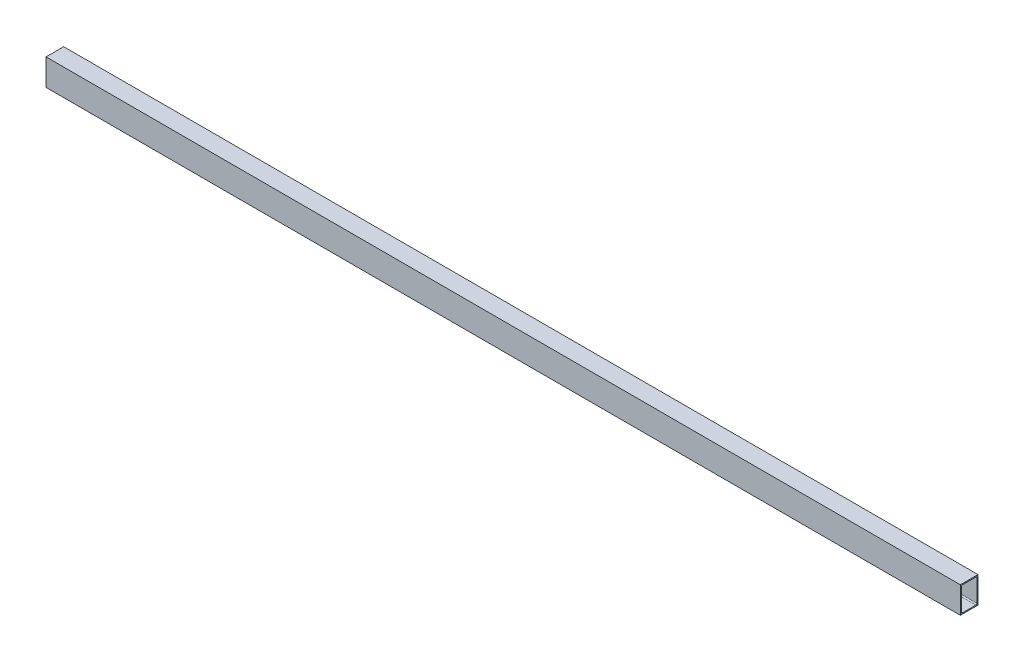
ISO-10303-21;
HEADER;
FILE_DESCRIPTION(('STEP AP214'),'2;1');
FILE_NAME('part.step','',(''),(''),'','','');
FILE_SCHEMA(('AUTOMOTIVE_DESIGN { 1 0 10303 214 1 1 1 1 }'));
ENDSEC;
DATA;
#1=APPLICATION_CONTEXT('core data for automotive mechanical design processes');
#2=APPLICATION_PROTOCOL_DEFINITION('international standard','automotive_design',2000,#1);
#3=PRODUCT_CONTEXT('',#1,'mechanical');
#4=PRODUCT('Part','Part','',(#3));
#5=PRODUCT_RELATED_PRODUCT_CATEGORY('part','',(#4));
#6=PRODUCT_DEFINITION_FORMATION('','',#4);
#7=PRODUCT_DEFINITION_CONTEXT('part definition',#1,'design');
#8=PRODUCT_DEFINITION('design','',#6,#7);
#9=PRODUCT_DEFINITION_SHAPE('','',#8);
#10=(LENGTH_UNIT() NAMED_UNIT(*) SI_UNIT(.MILLI.,.METRE.));
#11=(NAMED_UNIT(*) PLANE_ANGLE_UNIT() SI_UNIT($,.RADIAN.));
#12=(NAMED_UNIT(*) SI_UNIT($,.STERADIAN.) SOLID_ANGLE_UNIT());
#13=UNCERTAINTY_MEASURE_WITH_UNIT(LENGTH_MEASURE(1.E-05),#10,'distance_accuracy_value','');
#14=(GEOMETRIC_REPRESENTATION_CONTEXT(3) GLOBAL_UNCERTAINTY_ASSIGNED_CONTEXT((#13)) GLOBAL_UNIT_ASSIGNED_CONTEXT((#10,
#11,#12)) REPRESENTATION_CONTEXT('',''));
#15=CARTESIAN_POINT('',(0.,0.,0.));
#16=DIRECTION('',(0.,0.,1.));
#17=DIRECTION('',(1.,0.,0.));
#18=AXIS2_PLACEMENT_3D('',#15,#16,#17);
#19=CARTESIAN_POINT('',(5265.200001456,0.,0.));
#20=DIRECTION('',(1.,0.,0.));
#21=DIRECTION('',(0.,0.,-1.));
#22=AXIS2_PLACEMENT_3D('',#19,#20,#21);
#23=PLANE('',#22);
#24=DIRECTION('',(0.,1.,0.));
#25=VECTOR('',#24,1.);
#26=CARTESIAN_POINT('',(5265.200001456,0.,0.));
#27=LINE('',#26,#25);
#28=CARTESIAN_POINT('',(5265.200001456,0.,0.));
#29=VERTEX_POINT('',#28);
#30=CARTESIAN_POINT('',(5265.200001456,152.4,0.));
#31=VERTEX_POINT('',#30);
#32=EDGE_CURVE('E187',#29,#31,#27,.T.);
#33=ORIENTED_EDGE('',*,*,#32,.T.);
#34=DIRECTION('',(0.,0.,1.));
#35=VECTOR('',#34,1.);
#36=CARTESIAN_POINT('',(5265.200001456,152.4,0.));
#37=LINE('',#36,#35);
#38=CARTESIAN_POINT('',(5265.200001456,152.4,101.6));
#39=VERTEX_POINT('',#38);
#40=EDGE_CURVE('E190',#31,#39,#37,.T.);
#41=ORIENTED_EDGE('',*,*,#40,.T.);
#42=DIRECTION('',(0.,-1.,0.));
#43=VECTOR('',#42,1.);
#44=CARTESIAN_POINT('',(5265.200001456,0.,101.6));
#45=LINE('',#44,#43);
#46=CARTESIAN_POINT('',(5265.200001456,0.,101.6));
#47=VERTEX_POINT('',#46);
#48=EDGE_CURVE('E193',#39,#47,#45,.T.);
#49=ORIENTED_EDGE('',*,*,#48,.T.);
#50=DIRECTION('',(0.,0.,-1.));
#51=VECTOR('',#50,1.);
#52=CARTESIAN_POINT('',(5265.200001456,0.,0.));
#53=LINE('',#52,#51);
#54=EDGE_CURVE('E195',#47,#29,#53,.T.);
#55=ORIENTED_EDGE('',*,*,#54,.T.);
#56=EDGE_LOOP('',(#33,#41,#49,#55));
#57=FACE_BOUND('',#56,.T.);
#58=DIRECTION('',(0.,0.,-1.));
#59=VECTOR('',#58,1.);
#60=CARTESIAN_POINT('',(5265.200001456,6.35,12.7));
#61=LINE('',#60,#59);
#62=CARTESIAN_POINT('',(5265.200001456,6.35,88.8999999999999));
#63=VERTEX_POINT('',#62);
#64=CARTESIAN_POINT('',(5265.200001456,6.35,12.7));
#65=VERTEX_POINT('',#64);
#66=EDGE_CURVE('E130',#63,#65,#61,.T.);
#67=ORIENTED_EDGE('',*,*,#66,.F.);
#68=CARTESIAN_POINT('',(5265.200001456,12.7,88.9));
#69=DIRECTION('',(1.,0.,0.));
#70=DIRECTION('',(0.,0.,-1.));
#71=AXIS2_PLACEMENT_3D('',#68,#69,#70);
#72=CIRCLE('',#71,6.35);
#73=CARTESIAN_POINT('',(5265.200001456,12.7,95.25));
#74=VERTEX_POINT('',#73);
#75=EDGE_CURVE('E122',#74,#63,#72,.T.);
#76=ORIENTED_EDGE('',*,*,#75,.F.);
#77=DIRECTION('',(0.,-1.,0.));
#78=VECTOR('',#77,1.);
#79=CARTESIAN_POINT('',(5265.200001456,12.7,95.25));
#80=LINE('',#79,#78);
#81=CARTESIAN_POINT('',(5265.200001456,139.7,95.25));
#82=VERTEX_POINT('',#81);
#83=EDGE_CURVE('E155',#82,#74,#80,.T.);
#84=ORIENTED_EDGE('',*,*,#83,.F.);
#85=CARTESIAN_POINT('',(5265.200001456,139.7,88.9));
#86=DIRECTION('',(1.,0.,0.));
#87=DIRECTION('',(0.,0.,1.));
#88=AXIS2_PLACEMENT_3D('',#85,#86,#87);
#89=CIRCLE('',#88,6.34999999999999);
#90=CARTESIAN_POINT('',(5265.200001456,146.05,88.8999999999999));
#91=VERTEX_POINT('',#90);
#92=EDGE_CURVE('E153',#91,#82,#89,.T.);
#93=ORIENTED_EDGE('',*,*,#92,.F.);
#94=DIRECTION('',(0.,0.,1.));
#95=VECTOR('',#94,1.);
#96=CARTESIAN_POINT('',(5265.200001456,146.05,12.7));
#97=LINE('',#96,#95);
#98=CARTESIAN_POINT('',(5265.200001456,146.05,12.7));
#99=VERTEX_POINT('',#98);
#100=EDGE_CURVE('E151',#99,#91,#97,.T.);
#101=ORIENTED_EDGE('',*,*,#100,.F.);
#102=CARTESIAN_POINT('',(5265.200001456,139.7,12.7));
#103=DIRECTION('',(1.,0.,0.));
#104=DIRECTION('',(0.,0.,1.));
#105=AXIS2_PLACEMENT_3D('',#102,#103,#104);
#106=CIRCLE('',#105,6.35);
#107=CARTESIAN_POINT('',(5265.200001456,139.7,6.35));
#108=VERTEX_POINT('',#107);
#109=EDGE_CURVE('E149',#108,#99,#106,.T.);
#110=ORIENTED_EDGE('',*,*,#109,.F.);
#111=DIRECTION('',(0.,1.,0.));
#112=VECTOR('',#111,1.);
#113=CARTESIAN_POINT('',(5265.200001456,12.7,6.35));
#114=LINE('',#113,#112);
#115=CARTESIAN_POINT('',(5265.200001456,12.7,6.35));
#116=VERTEX_POINT('',#115);
#117=EDGE_CURVE('E145',#116,#108,#114,.T.);
#118=ORIENTED_EDGE('',*,*,#117,.F.);
#119=CARTESIAN_POINT('',(5265.200001456,12.7,12.7));
#120=DIRECTION('',(1.,0.,0.));
#121=DIRECTION('',(0.,0.,1.));
#122=AXIS2_PLACEMENT_3D('',#119,#120,#121);
#123=CIRCLE('',#122,6.35);
#124=EDGE_CURVE('E143',#65,#116,#123,.T.);
#125=ORIENTED_EDGE('',*,*,#124,.F.);
#126=EDGE_LOOP('',(#67,#76,#84,#93,#101,#110,#118,#125));
#127=FACE_BOUND('',#126,.T.);
#128=ADVANCED_FACE('F33',(#57,#127),#23,.T.);
#129=CARTESIAN_POINT('',(0.,0.,0.));
#130=DIRECTION('',(1.,0.,0.));
#131=DIRECTION('',(0.,0.,-1.));
#132=AXIS2_PLACEMENT_3D('',#129,#130,#131);
#133=PLANE('',#132);
#134=DIRECTION('',(0.,1.,0.));
#135=VECTOR('',#134,1.);
#136=CARTESIAN_POINT('',(0.,0.,0.));
#137=LINE('',#136,#135);
#138=CARTESIAN_POINT('',(0.,0.,0.));
#139=VERTEX_POINT('',#138);
#140=CARTESIAN_POINT('',(0.,152.4,0.));
#141=VERTEX_POINT('',#140);
#142=EDGE_CURVE('E138',#139,#141,#137,.T.);
#143=ORIENTED_EDGE('',*,*,#142,.F.);
#144=DIRECTION('',(0.,0.,-1.));
#145=VECTOR('',#144,1.);
#146=CARTESIAN_POINT('',(0.,0.,0.));
#147=LINE('',#146,#145);
#148=CARTESIAN_POINT('',(0.,0.,101.6));
#149=VERTEX_POINT('',#148);
#150=EDGE_CURVE('E191',#149,#139,#147,.T.);
#151=ORIENTED_EDGE('',*,*,#150,.F.);
#152=DIRECTION('',(0.,-1.,0.));
#153=VECTOR('',#152,1.);
#154=CARTESIAN_POINT('',(0.,0.,101.6));
#155=LINE('',#154,#153);
#156=CARTESIAN_POINT('',(0.,152.4,101.6));
#157=VERTEX_POINT('',#156);
#158=EDGE_CURVE('E202',#157,#149,#155,.T.);
#159=ORIENTED_EDGE('',*,*,#158,.F.);
#160=DIRECTION('',(0.,0.,1.));
#161=VECTOR('',#160,1.);
#162=CARTESIAN_POINT('',(0.,152.4,0.));
#163=LINE('',#162,#161);
#164=EDGE_CURVE('E200',#141,#157,#163,.T.);
#165=ORIENTED_EDGE('',*,*,#164,.F.);
#166=EDGE_LOOP('',(#143,#151,#159,#165));
#167=FACE_BOUND('',#166,.T.);
#168=CARTESIAN_POINT('',(0.,12.7,88.9));
#169=DIRECTION('',(1.,0.,0.));
#170=DIRECTION('',(0.,0.,-1.));
#171=AXIS2_PLACEMENT_3D('',#168,#169,#170);
#172=CIRCLE('',#171,6.35);
#173=CARTESIAN_POINT('',(0.,12.7,95.25));
#174=VERTEX_POINT('',#173);
#175=CARTESIAN_POINT('',(0.,6.35,88.8999999999999));
#176=VERTEX_POINT('',#175);
#177=EDGE_CURVE('E56',#174,#176,#172,.T.);
#178=ORIENTED_EDGE('',*,*,#177,.T.);
#179=DIRECTION('',(0.,0.,-1.));
#180=VECTOR('',#179,1.);
#181=CARTESIAN_POINT('',(0.,6.35,12.7));
#182=LINE('',#181,#180);
#183=CARTESIAN_POINT('',(0.,6.35,12.7));
#184=VERTEX_POINT('',#183);
#185=EDGE_CURVE('E137',#176,#184,#182,.T.);
#186=ORIENTED_EDGE('',*,*,#185,.T.);
#187=CARTESIAN_POINT('',(0.,12.7,12.7));
#188=DIRECTION('',(1.,0.,0.));
#189=DIRECTION('',(0.,0.,1.));
#190=AXIS2_PLACEMENT_3D('',#187,#188,#189);
#191=CIRCLE('',#190,6.35);
#192=CARTESIAN_POINT('',(0.,12.7,6.35));
#193=VERTEX_POINT('',#192);
#194=EDGE_CURVE('E159',#184,#193,#191,.T.);
#195=ORIENTED_EDGE('',*,*,#194,.T.);
#196=DIRECTION('',(0.,1.,0.));
#197=VECTOR('',#196,1.);
#198=CARTESIAN_POINT('',(0.,12.7,6.35));
#199=LINE('',#198,#197);
#200=CARTESIAN_POINT('',(0.,139.7,6.35));
#201=VERTEX_POINT('',#200);
#202=EDGE_CURVE('E162',#193,#201,#199,.T.);
#203=ORIENTED_EDGE('',*,*,#202,.T.);
#204=CARTESIAN_POINT('',(0.,139.7,12.7));
#205=DIRECTION('',(1.,0.,0.));
#206=DIRECTION('',(0.,0.,1.));
#207=AXIS2_PLACEMENT_3D('',#204,#205,#206);
#208=CIRCLE('',#207,6.35);
#209=CARTESIAN_POINT('',(0.,146.05,12.7));
#210=VERTEX_POINT('',#209);
#211=EDGE_CURVE('E165',#201,#210,#208,.T.);
#212=ORIENTED_EDGE('',*,*,#211,.T.);
#213=DIRECTION('',(0.,0.,1.));
#214=VECTOR('',#213,1.);
#215=CARTESIAN_POINT('',(0.,146.05,12.7));
#216=LINE('',#215,#214);
#217=CARTESIAN_POINT('',(0.,146.05,88.8999999999999));
#218=VERTEX_POINT('',#217);
#219=EDGE_CURVE('E168',#210,#218,#216,.T.);
#220=ORIENTED_EDGE('',*,*,#219,.T.);
#221=CARTESIAN_POINT('',(0.,139.7,88.9));
#222=DIRECTION('',(1.,0.,0.));
#223=DIRECTION('',(0.,0.,1.));
#224=AXIS2_PLACEMENT_3D('',#221,#222,#223);
#225=CIRCLE('',#224,6.34999999999999);
#226=CARTESIAN_POINT('',(0.,139.7,95.25));
#227=VERTEX_POINT('',#226);
#228=EDGE_CURVE('E171',#218,#227,#225,.T.);
#229=ORIENTED_EDGE('',*,*,#228,.T.);
#230=DIRECTION('',(0.,-1.,0.));
#231=VECTOR('',#230,1.);
#232=CARTESIAN_POINT('',(0.,12.7,95.25));
#233=LINE('',#232,#231);
#234=EDGE_CURVE('E131',#227,#174,#233,.T.);
#235=ORIENTED_EDGE('',*,*,#234,.T.);
#236=EDGE_LOOP('',(#178,#186,#195,#203,#212,#220,#229,#235));
#237=FACE_BOUND('',#236,.T.);
#238=ADVANCED_FACE('F220',(#167,#237),#133,.F.);
#239=CARTESIAN_POINT('',(5265.200001456,0.,0.));
#240=DIRECTION('',(0.,0.,1.));
#241=DIRECTION('',(1.,0.,0.));
#242=AXIS2_PLACEMENT_3D('',#239,#240,#241);
#243=PLANE('',#242);
#244=ORIENTED_EDGE('',*,*,#142,.T.);
#245=DIRECTION('',(-1.,0.,0.));
#246=VECTOR('',#245,1.);
#247=CARTESIAN_POINT('',(5265.200001456,152.4,0.));
#248=LINE('',#247,#246);
#249=EDGE_CURVE('E11',#31,#141,#248,.T.);
#250=ORIENTED_EDGE('',*,*,#249,.F.);
#251=ORIENTED_EDGE('',*,*,#32,.F.);
#252=DIRECTION('',(-1.,0.,0.));
#253=VECTOR('',#252,1.);
#254=CARTESIAN_POINT('',(5265.200001456,0.,0.));
#255=LINE('',#254,#253);
#256=EDGE_CURVE('E197',#29,#139,#255,.T.);
#257=ORIENTED_EDGE('',*,*,#256,.T.);
#258=EDGE_LOOP('',(#244,#250,#251,#257));
#259=FACE_BOUND('',#258,.T.);
#260=ADVANCED_FACE('F35',(#259),#243,.F.);
#261=CARTESIAN_POINT('',(5265.200001456,152.4,0.));
#262=DIRECTION('',(0.,-1.,0.));
#263=DIRECTION('',(0.,0.,-1.));
#264=AXIS2_PLACEMENT_3D('',#261,#262,#263);
#265=PLANE('',#264);
#266=ORIENTED_EDGE('',*,*,#164,.T.);
#267=DIRECTION('',(-1.,0.,0.));
#268=VECTOR('',#267,1.);
#269=CARTESIAN_POINT('',(5265.200001456,152.4,101.6));
#270=LINE('',#269,#268);
#271=EDGE_CURVE('E41',#39,#157,#270,.T.);
#272=ORIENTED_EDGE('',*,*,#271,.F.);
#273=ORIENTED_EDGE('',*,*,#40,.F.);
#274=ORIENTED_EDGE('',*,*,#249,.T.);
#275=EDGE_LOOP('',(#266,#272,#273,#274));
#276=FACE_BOUND('',#275,.T.);
#277=ADVANCED_FACE('F230',(#276),#265,.F.);
#278=CARTESIAN_POINT('',(5265.200001456,0.,101.6));
#279=DIRECTION('',(0.,0.,-1.));
#280=DIRECTION('',(-1.,0.,0.));
#281=AXIS2_PLACEMENT_3D('',#278,#279,#280);
#282=PLANE('',#281);
#283=ORIENTED_EDGE('',*,*,#158,.T.);
#284=DIRECTION('',(-1.,0.,0.));
#285=VECTOR('',#284,1.);
#286=CARTESIAN_POINT('',(5265.200001456,0.,101.6));
#287=LINE('',#286,#285);
#288=EDGE_CURVE('E207',#47,#149,#287,.T.);
#289=ORIENTED_EDGE('',*,*,#288,.F.);
#290=ORIENTED_EDGE('',*,*,#48,.F.);
#291=ORIENTED_EDGE('',*,*,#271,.T.);
#292=EDGE_LOOP('',(#283,#289,#290,#291));
#293=FACE_BOUND('',#292,.T.);
#294=ADVANCED_FACE('F214',(#293),#282,.F.);
#295=CARTESIAN_POINT('',(5265.200001456,0.,0.));
#296=DIRECTION('',(0.,1.,0.));
#297=DIRECTION('',(0.,0.,1.));
#298=AXIS2_PLACEMENT_3D('',#295,#296,#297);
#299=PLANE('',#298);
#300=ORIENTED_EDGE('',*,*,#150,.T.);
#301=ORIENTED_EDGE('',*,*,#256,.F.);
#302=ORIENTED_EDGE('',*,*,#54,.F.);
#303=ORIENTED_EDGE('',*,*,#288,.T.);
#304=EDGE_LOOP('',(#300,#301,#302,#303));
#305=FACE_BOUND('',#304,.T.);
#306=ADVANCED_FACE('F224',(#305),#299,.F.);
#307=CARTESIAN_POINT('',(5265.200001456,12.7,88.9));
#308=DIRECTION('',(-1.,0.,0.));
#309=DIRECTION('',(0.,0.,1.));
#310=AXIS2_PLACEMENT_3D('',#307,#308,#309);
#311=CYLINDRICAL_SURFACE('',#310,6.35);
#312=ORIENTED_EDGE('',*,*,#177,.F.);
#313=DIRECTION('',(-1.,0.,0.));
#314=VECTOR('',#313,1.);
#315=CARTESIAN_POINT('',(5265.200001456,12.7,95.25));
#316=LINE('',#315,#314);
#317=EDGE_CURVE('E126',#74,#174,#316,.T.);
#318=ORIENTED_EDGE('',*,*,#317,.F.);
#319=ORIENTED_EDGE('',*,*,#75,.T.);
#320=DIRECTION('',(-1.,0.,0.));
#321=VECTOR('',#320,1.);
#322=CARTESIAN_POINT('',(5265.200001456,6.35,88.8999999999999));
#323=LINE('',#322,#321);
#324=EDGE_CURVE('E125',#63,#176,#323,.T.);
#325=ORIENTED_EDGE('',*,*,#324,.T.);
#326=EDGE_LOOP('',(#312,#318,#319,#325));
#327=FACE_BOUND('',#326,.T.);
#328=ADVANCED_FACE('F124',(#327),#311,.F.);
#329=CARTESIAN_POINT('',(5265.200001456,6.35,12.7));
#330=DIRECTION('',(0.,1.,0.));
#331=DIRECTION('',(0.,0.,1.));
#332=AXIS2_PLACEMENT_3D('',#329,#330,#331);
#333=PLANE('',#332);
#334=ORIENTED_EDGE('',*,*,#185,.F.);
#335=ORIENTED_EDGE('',*,*,#324,.F.);
#336=ORIENTED_EDGE('',*,*,#66,.T.);
#337=DIRECTION('',(-1.,0.,0.));
#338=VECTOR('',#337,1.);
#339=CARTESIAN_POINT('',(5265.200001456,6.35,12.7));
#340=LINE('',#339,#338);
#341=EDGE_CURVE('E139',#65,#184,#340,.T.);
#342=ORIENTED_EDGE('',*,*,#341,.T.);
#343=EDGE_LOOP('',(#334,#335,#336,#342));
#344=FACE_BOUND('',#343,.T.);
#345=ADVANCED_FACE('F134',(#344),#333,.T.);
#346=CARTESIAN_POINT('',(5265.200001456,12.7,12.7));
#347=DIRECTION('',(-1.,0.,0.));
#348=DIRECTION('',(0.,0.,1.));
#349=AXIS2_PLACEMENT_3D('',#346,#347,#348);
#350=CYLINDRICAL_SURFACE('',#349,6.35);
#351=ORIENTED_EDGE('',*,*,#194,.F.);
#352=ORIENTED_EDGE('',*,*,#341,.F.);
#353=ORIENTED_EDGE('',*,*,#124,.T.);
#354=DIRECTION('',(-1.,0.,0.));
#355=VECTOR('',#354,1.);
#356=CARTESIAN_POINT('',(5265.200001456,12.7,6.35));
#357=LINE('',#356,#355);
#358=EDGE_CURVE('E184',#116,#193,#357,.T.);
#359=ORIENTED_EDGE('',*,*,#358,.T.);
#360=EDGE_LOOP('',(#351,#352,#353,#359));
#361=FACE_BOUND('',#360,.T.);
#362=ADVANCED_FACE('F253',(#361),#350,.F.);
#363=CARTESIAN_POINT('',(5265.200001456,12.7,6.35));
#364=DIRECTION('',(0.,0.,1.));
#365=DIRECTION('',(1.,0.,0.));
#366=AXIS2_PLACEMENT_3D('',#363,#364,#365);
#367=PLANE('',#366);
#368=ORIENTED_EDGE('',*,*,#202,.F.);
#369=ORIENTED_EDGE('',*,*,#358,.F.);
#370=ORIENTED_EDGE('',*,*,#117,.T.);
#371=DIRECTION('',(-1.,0.,0.));
#372=VECTOR('',#371,1.);
#373=CARTESIAN_POINT('',(5265.200001456,139.7,6.35));
#374=LINE('',#373,#372);
#375=EDGE_CURVE('E182',#108,#201,#374,.T.);
#376=ORIENTED_EDGE('',*,*,#375,.T.);
#377=EDGE_LOOP('',(#368,#369,#370,#376));
#378=FACE_BOUND('',#377,.T.);
#379=ADVANCED_FACE('F257',(#378),#367,.T.);
#380=CARTESIAN_POINT('',(5265.200001456,139.7,12.7));
#381=DIRECTION('',(-1.,0.,0.));
#382=DIRECTION('',(0.,0.,1.));
#383=AXIS2_PLACEMENT_3D('',#380,#381,#382);
#384=CYLINDRICAL_SURFACE('',#383,6.35);
#385=ORIENTED_EDGE('',*,*,#211,.F.);
#386=ORIENTED_EDGE('',*,*,#375,.F.);
#387=ORIENTED_EDGE('',*,*,#109,.T.);
#388=DIRECTION('',(-1.,0.,0.));
#389=VECTOR('',#388,1.);
#390=CARTESIAN_POINT('',(5265.200001456,146.05,12.7));
#391=LINE('',#390,#389);
#392=EDGE_CURVE('E180',#99,#210,#391,.T.);
#393=ORIENTED_EDGE('',*,*,#392,.T.);
#394=EDGE_LOOP('',(#385,#386,#387,#393));
#395=FACE_BOUND('',#394,.T.);
#396=ADVANCED_FACE('F263',(#395),#384,.F.);
#397=CARTESIAN_POINT('',(5265.200001456,146.05,12.7));
#398=DIRECTION('',(0.,-1.,0.));
#399=DIRECTION('',(0.,0.,-1.));
#400=AXIS2_PLACEMENT_3D('',#397,#398,#399);
#401=PLANE('',#400);
#402=ORIENTED_EDGE('',*,*,#219,.F.);
#403=ORIENTED_EDGE('',*,*,#392,.F.);
#404=ORIENTED_EDGE('',*,*,#100,.T.);
#405=DIRECTION('',(-1.,0.,0.));
#406=VECTOR('',#405,1.);
#407=CARTESIAN_POINT('',(5265.200001456,146.05,88.8999999999999));
#408=LINE('',#407,#406);
#409=EDGE_CURVE('E178',#91,#218,#408,.T.);
#410=ORIENTED_EDGE('',*,*,#409,.T.);
#411=EDGE_LOOP('',(#402,#403,#404,#410));
#412=FACE_BOUND('',#411,.T.);
#413=ADVANCED_FACE('F267',(#412),#401,.T.);
#414=CARTESIAN_POINT('',(5265.200001456,139.7,88.9));
#415=DIRECTION('',(-1.,0.,0.));
#416=DIRECTION('',(0.,0.,1.));
#417=AXIS2_PLACEMENT_3D('',#414,#415,#416);
#418=CYLINDRICAL_SURFACE('',#417,6.34999999999999);
#419=ORIENTED_EDGE('',*,*,#228,.F.);
#420=ORIENTED_EDGE('',*,*,#409,.F.);
#421=ORIENTED_EDGE('',*,*,#92,.T.);
#422=DIRECTION('',(-1.,0.,0.));
#423=VECTOR('',#422,1.);
#424=CARTESIAN_POINT('',(5265.200001456,139.7,95.25));
#425=LINE('',#424,#423);
#426=EDGE_CURVE('E48',#82,#227,#425,.T.);
#427=ORIENTED_EDGE('',*,*,#426,.T.);
#428=EDGE_LOOP('',(#419,#420,#421,#427));
#429=FACE_BOUND('',#428,.T.);
#430=ADVANCED_FACE('F271',(#429),#418,.F.);
#431=CARTESIAN_POINT('',(5265.200001456,12.7,95.25));
#432=DIRECTION('',(0.,0.,-1.));
#433=DIRECTION('',(0.,1.,0.));
#434=AXIS2_PLACEMENT_3D('',#431,#432,#433);
#435=PLANE('',#434);
#436=ORIENTED_EDGE('',*,*,#234,.F.);
#437=ORIENTED_EDGE('',*,*,#426,.F.);
#438=ORIENTED_EDGE('',*,*,#83,.T.);
#439=ORIENTED_EDGE('',*,*,#317,.T.);
#440=EDGE_LOOP('',(#436,#437,#438,#439));
#441=FACE_BOUND('',#440,.T.);
#442=ADVANCED_FACE('F275',(#441),#435,.T.);
#443=CLOSED_SHELL('',(#128,#238,#260,#277,#294,#306,#328,#345,#362,#379,#396,#413,#430,#442));
#444=MANIFOLD_SOLID_BREP('B2',#443);
#445=ADVANCED_BREP_SHAPE_REPRESENTATION('',(#18,#444),#14);
#446=SHAPE_DEFINITION_REPRESENTATION(#9,#445);
ENDSEC;
END-ISO-10303-21;
